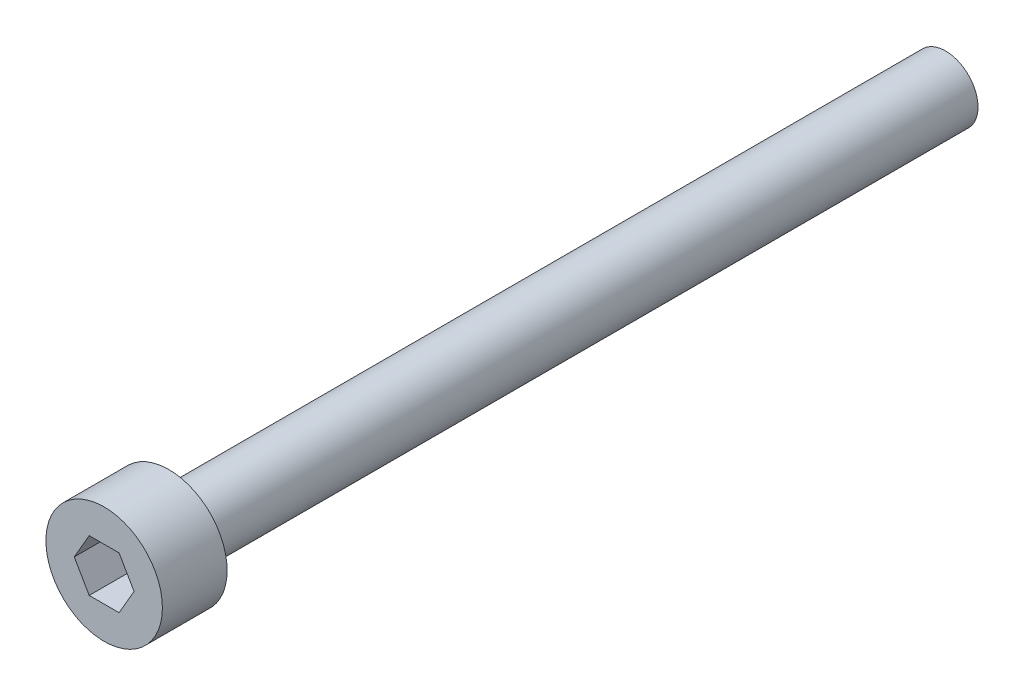
ISO-10303-21;
HEADER;
FILE_DESCRIPTION(('STEP AP214'),'2;1');
FILE_NAME('part.step','',(''),(''),'','','');
FILE_SCHEMA(('AUTOMOTIVE_DESIGN { 1 0 10303 214 1 1 1 1 }'));
ENDSEC;
DATA;
#1=APPLICATION_CONTEXT('core data for automotive mechanical design processes');
#2=APPLICATION_PROTOCOL_DEFINITION('international standard','automotive_design',2000,#1);
#3=PRODUCT_CONTEXT('',#1,'mechanical');
#4=PRODUCT('Part','Part','',(#3));
#5=PRODUCT_RELATED_PRODUCT_CATEGORY('part','',(#4));
#6=PRODUCT_DEFINITION_FORMATION('','',#4);
#7=PRODUCT_DEFINITION_CONTEXT('part definition',#1,'design');
#8=PRODUCT_DEFINITION('design','',#6,#7);
#9=PRODUCT_DEFINITION_SHAPE('','',#8);
#10=(LENGTH_UNIT() NAMED_UNIT(*) SI_UNIT(.MILLI.,.METRE.));
#11=(NAMED_UNIT(*) PLANE_ANGLE_UNIT() SI_UNIT($,.RADIAN.));
#12=(NAMED_UNIT(*) SI_UNIT($,.STERADIAN.) SOLID_ANGLE_UNIT());
#13=UNCERTAINTY_MEASURE_WITH_UNIT(LENGTH_MEASURE(1.E-05),#10,'distance_accuracy_value','');
#14=(GEOMETRIC_REPRESENTATION_CONTEXT(3) GLOBAL_UNCERTAINTY_ASSIGNED_CONTEXT((#13)) GLOBAL_UNIT_ASSIGNED_CONTEXT((#10,
#11,#12)) REPRESENTATION_CONTEXT('',''));
#15=CARTESIAN_POINT('',(0.,0.,0.));
#16=DIRECTION('',(0.,0.,1.));
#17=DIRECTION('',(1.,0.,0.));
#18=AXIS2_PLACEMENT_3D('',#15,#16,#17);
#19=CARTESIAN_POINT('',(0.,0.,30.));
#20=DIRECTION('',(0.,0.,-1.));
#21=DIRECTION('',(-1.,0.,0.));
#22=AXIS2_PLACEMENT_3D('',#19,#20,#21);
#23=CYLINDRICAL_SURFACE('',#22,1.25);
#24=CARTESIAN_POINT('',(0.,0.,30.));
#25=DIRECTION('',(0.,0.,1.));
#26=DIRECTION('',(1.,0.,0.));
#27=AXIS2_PLACEMENT_3D('',#24,#25,#26);
#28=CIRCLE('',#27,1.25);
#29=CARTESIAN_POINT('',(1.25,0.,30.));
#30=VERTEX_POINT('',#29);
#31=EDGE_CURVE('E11',#30,#30,#28,.T.);
#32=ORIENTED_EDGE('',*,*,#31,.F.);
#33=EDGE_LOOP('',(#32));
#34=FACE_BOUND('',#33,.T.);
#35=CARTESIAN_POINT('',(0.,0.,0.));
#36=DIRECTION('',(0.,0.,1.));
#37=DIRECTION('',(1.,0.,0.));
#38=AXIS2_PLACEMENT_3D('',#35,#36,#37);
#39=CIRCLE('',#38,1.25);
#40=CARTESIAN_POINT('',(1.25,0.,0.));
#41=VERTEX_POINT('',#40);
#42=EDGE_CURVE('E42',#41,#41,#39,.T.);
#43=ORIENTED_EDGE('',*,*,#42,.T.);
#44=EDGE_LOOP('',(#43));
#45=FACE_BOUND('',#44,.T.);
#46=ADVANCED_FACE('F39',(#34,#45),#23,.T.);
#47=CARTESIAN_POINT('',(0.,0.,0.));
#48=DIRECTION('',(0.,0.,1.));
#49=DIRECTION('',(1.,0.,0.));
#50=AXIS2_PLACEMENT_3D('',#47,#48,#49);
#51=PLANE('',#50);
#52=ORIENTED_EDGE('',*,*,#42,.F.);
#53=EDGE_LOOP('',(#52));
#54=FACE_BOUND('',#53,.T.);
#55=ADVANCED_FACE('F189',(#54),#51,.F.);
#56=CARTESIAN_POINT('',(0.,0.,32.5));
#57=DIRECTION('',(0.,0.,-1.));
#58=DIRECTION('',(-1.,0.,0.));
#59=AXIS2_PLACEMENT_3D('',#56,#57,#58);
#60=CYLINDRICAL_SURFACE('',#59,2.25);
#61=CARTESIAN_POINT('',(0.,0.,32.5));
#62=DIRECTION('',(0.,0.,1.));
#63=DIRECTION('',(1.,0.,0.));
#64=AXIS2_PLACEMENT_3D('',#61,#62,#63);
#65=CIRCLE('',#64,2.25);
#66=CARTESIAN_POINT('',(2.25,0.,32.5));
#67=VERTEX_POINT('',#66);
#68=EDGE_CURVE('E163',#67,#67,#65,.T.);
#69=ORIENTED_EDGE('',*,*,#68,.F.);
#70=EDGE_LOOP('',(#69));
#71=FACE_BOUND('',#70,.T.);
#72=CARTESIAN_POINT('',(0.,0.,30.));
#73=DIRECTION('',(0.,0.,1.));
#74=DIRECTION('',(1.,0.,0.));
#75=AXIS2_PLACEMENT_3D('',#72,#73,#74);
#76=CIRCLE('',#75,2.25);
#77=CARTESIAN_POINT('',(2.25,0.,30.));
#78=VERTEX_POINT('',#77);
#79=EDGE_CURVE('E153',#78,#78,#76,.T.);
#80=ORIENTED_EDGE('',*,*,#79,.T.);
#81=EDGE_LOOP('',(#80));
#82=FACE_BOUND('',#81,.T.);
#83=ADVANCED_FACE('F171',(#71,#82),#60,.T.);
#84=CARTESIAN_POINT('',(0.,0.,32.5));
#85=DIRECTION('',(0.,0.,1.));
#86=DIRECTION('',(1.,0.,0.));
#87=AXIS2_PLACEMENT_3D('',#84,#85,#86);
#88=PLANE('',#87);
#89=DIRECTION('',(0.5,0.866025403784439,0.));
#90=VECTOR('',#89,1.);
#91=CARTESIAN_POINT('',(0.577350269189626,-1.,32.5));
#92=LINE('',#91,#90);
#93=CARTESIAN_POINT('',(0.577350269189626,-1.,32.5));
#94=VERTEX_POINT('',#93);
#95=CARTESIAN_POINT('',(1.15470053837925,0.,32.5));
#96=VERTEX_POINT('',#95);
#97=EDGE_CURVE('E54',#94,#96,#92,.T.);
#98=ORIENTED_EDGE('',*,*,#97,.F.);
#99=DIRECTION('',(1.,0.,0.));
#100=VECTOR('',#99,1.);
#101=CARTESIAN_POINT('',(-0.577350269189626,-1.,32.5));
#102=LINE('',#101,#100);
#103=CARTESIAN_POINT('',(-0.577350269189626,-1.,32.5));
#104=VERTEX_POINT('',#103);
#105=EDGE_CURVE('E147',#104,#94,#102,.T.);
#106=ORIENTED_EDGE('',*,*,#105,.F.);
#107=DIRECTION('',(0.5,-0.866025403784439,0.));
#108=VECTOR('',#107,1.);
#109=CARTESIAN_POINT('',(-1.15470053837925,0.,32.5));
#110=LINE('',#109,#108);
#111=CARTESIAN_POINT('',(-1.15470053837925,0.,32.5));
#112=VERTEX_POINT('',#111);
#113=EDGE_CURVE('E144',#112,#104,#110,.T.);
#114=ORIENTED_EDGE('',*,*,#113,.F.);
#115=DIRECTION('',(-0.5,-0.866025403784439,0.));
#116=VECTOR('',#115,1.);
#117=CARTESIAN_POINT('',(-0.577350269189626,1.,32.5));
#118=LINE('',#117,#116);
#119=CARTESIAN_POINT('',(-0.577350269189626,1.,32.5));
#120=VERTEX_POINT('',#119);
#121=EDGE_CURVE('E102',#120,#112,#118,.T.);
#122=ORIENTED_EDGE('',*,*,#121,.F.);
#123=DIRECTION('',(-1.,0.,0.));
#124=VECTOR('',#123,1.);
#125=CARTESIAN_POINT('',(0.577350269189625,1.,32.5));
#126=LINE('',#125,#124);
#127=CARTESIAN_POINT('',(0.577350269189625,1.,32.5));
#128=VERTEX_POINT('',#127);
#129=EDGE_CURVE('E138',#128,#120,#126,.T.);
#130=ORIENTED_EDGE('',*,*,#129,.F.);
#131=DIRECTION('',(-0.5,0.866025403784439,0.));
#132=VECTOR('',#131,1.);
#133=CARTESIAN_POINT('',(1.15470053837925,0.,32.5));
#134=LINE('',#133,#132);
#135=EDGE_CURVE('E134',#96,#128,#134,.T.);
#136=ORIENTED_EDGE('',*,*,#135,.F.);
#137=EDGE_LOOP('',(#98,#106,#114,#122,#130,#136));
#138=FACE_BOUND('',#137,.T.);
#139=ORIENTED_EDGE('',*,*,#68,.T.);
#140=EDGE_LOOP('',(#139));
#141=FACE_BOUND('',#140,.T.);
#142=ADVANCED_FACE('F176',(#138,#141),#88,.T.);
#143=CARTESIAN_POINT('',(0.,0.,30.));
#144=DIRECTION('',(0.,0.,1.));
#145=DIRECTION('',(1.,0.,0.));
#146=AXIS2_PLACEMENT_3D('',#143,#144,#145);
#147=PLANE('',#146);
#148=ORIENTED_EDGE('',*,*,#31,.T.);
#149=EDGE_LOOP('',(#148));
#150=FACE_BOUND('',#149,.T.);
#151=ORIENTED_EDGE('',*,*,#79,.F.);
#152=EDGE_LOOP('',(#151));
#153=FACE_BOUND('',#152,.T.);
#154=ADVANCED_FACE('F173',(#150,#153),#147,.F.);
#155=CARTESIAN_POINT('',(0.577350269189626,-1.,31.));
#156=DIRECTION('',(0.866025403784439,-0.5,0.));
#157=DIRECTION('',(0.5,0.866025403784439,0.));
#158=AXIS2_PLACEMENT_3D('',#155,#156,#157);
#159=PLANE('',#158);
#160=ORIENTED_EDGE('',*,*,#97,.T.);
#161=DIRECTION('',(0.,0.,1.));
#162=VECTOR('',#161,1.);
#163=CARTESIAN_POINT('',(1.15470053837925,0.,31.));
#164=LINE('',#163,#162);
#165=CARTESIAN_POINT('',(1.15470053837925,0.,31.));
#166=VERTEX_POINT('',#165);
#167=EDGE_CURVE('E84',#166,#96,#164,.T.);
#168=ORIENTED_EDGE('',*,*,#167,.F.);
#169=DIRECTION('',(0.5,0.866025403784439,0.));
#170=VECTOR('',#169,1.);
#171=CARTESIAN_POINT('',(0.577350269189626,-1.,31.));
#172=LINE('',#171,#170);
#173=CARTESIAN_POINT('',(0.577350269189626,-1.,31.));
#174=VERTEX_POINT('',#173);
#175=EDGE_CURVE('E150',#174,#166,#172,.T.);
#176=ORIENTED_EDGE('',*,*,#175,.F.);
#177=DIRECTION('',(0.,0.,1.));
#178=VECTOR('',#177,1.);
#179=CARTESIAN_POINT('',(0.577350269189626,-1.,31.));
#180=LINE('',#179,#178);
#181=EDGE_CURVE('E62',#174,#94,#180,.T.);
#182=ORIENTED_EDGE('',*,*,#181,.T.);
#183=EDGE_LOOP('',(#160,#168,#176,#182));
#184=FACE_BOUND('',#183,.T.);
#185=ADVANCED_FACE('F175',(#184),#159,.F.);
#186=CARTESIAN_POINT('',(-0.577350269189626,-1.,31.));
#187=DIRECTION('',(0.,-1.,0.));
#188=DIRECTION('',(1.,0.,0.));
#189=AXIS2_PLACEMENT_3D('',#186,#187,#188);
#190=PLANE('',#189);
#191=ORIENTED_EDGE('',*,*,#105,.T.);
#192=ORIENTED_EDGE('',*,*,#181,.F.);
#193=DIRECTION('',(1.,0.,0.));
#194=VECTOR('',#193,1.);
#195=CARTESIAN_POINT('',(-0.577350269189626,-1.,31.));
#196=LINE('',#195,#194);
#197=CARTESIAN_POINT('',(-0.577350269189626,-1.,31.));
#198=VERTEX_POINT('',#197);
#199=EDGE_CURVE('E116',#198,#174,#196,.T.);
#200=ORIENTED_EDGE('',*,*,#199,.F.);
#201=DIRECTION('',(0.,0.,1.));
#202=VECTOR('',#201,1.);
#203=CARTESIAN_POINT('',(-0.577350269189626,-1.,31.));
#204=LINE('',#203,#202);
#205=EDGE_CURVE('E107',#198,#104,#204,.T.);
#206=ORIENTED_EDGE('',*,*,#205,.T.);
#207=EDGE_LOOP('',(#191,#192,#200,#206));
#208=FACE_BOUND('',#207,.T.);
#209=ADVANCED_FACE('F183',(#208),#190,.F.);
#210=CARTESIAN_POINT('',(-1.15470053837925,0.,31.));
#211=DIRECTION('',(-0.866025403784439,-0.5,0.));
#212=DIRECTION('',(0.5,-0.866025403784439,0.));
#213=AXIS2_PLACEMENT_3D('',#210,#211,#212);
#214=PLANE('',#213);
#215=ORIENTED_EDGE('',*,*,#113,.T.);
#216=ORIENTED_EDGE('',*,*,#205,.F.);
#217=DIRECTION('',(0.5,-0.866025403784439,0.));
#218=VECTOR('',#217,1.);
#219=CARTESIAN_POINT('',(-1.15470053837925,0.,31.));
#220=LINE('',#219,#218);
#221=CARTESIAN_POINT('',(-1.15470053837925,0.,31.));
#222=VERTEX_POINT('',#221);
#223=EDGE_CURVE('E111',#222,#198,#220,.T.);
#224=ORIENTED_EDGE('',*,*,#223,.F.);
#225=DIRECTION('',(0.,0.,1.));
#226=VECTOR('',#225,1.);
#227=CARTESIAN_POINT('',(-1.15470053837925,0.,31.));
#228=LINE('',#227,#226);
#229=EDGE_CURVE('E95',#222,#112,#228,.T.);
#230=ORIENTED_EDGE('',*,*,#229,.T.);
#231=EDGE_LOOP('',(#215,#216,#224,#230));
#232=FACE_BOUND('',#231,.T.);
#233=ADVANCED_FACE('F112',(#232),#214,.F.);
#234=CARTESIAN_POINT('',(-0.577350269189626,1.,31.));
#235=DIRECTION('',(-0.866025403784439,0.5,0.));
#236=DIRECTION('',(-0.5,-0.866025403784439,0.));
#237=AXIS2_PLACEMENT_3D('',#234,#235,#236);
#238=PLANE('',#237);
#239=ORIENTED_EDGE('',*,*,#121,.T.);
#240=ORIENTED_EDGE('',*,*,#229,.F.);
#241=DIRECTION('',(-0.5,-0.866025403784439,0.));
#242=VECTOR('',#241,1.);
#243=CARTESIAN_POINT('',(-0.577350269189626,1.,31.));
#244=LINE('',#243,#242);
#245=CARTESIAN_POINT('',(-0.577350269189626,1.,31.));
#246=VERTEX_POINT('',#245);
#247=EDGE_CURVE('E99',#246,#222,#244,.T.);
#248=ORIENTED_EDGE('',*,*,#247,.F.);
#249=DIRECTION('',(0.,0.,1.));
#250=VECTOR('',#249,1.);
#251=CARTESIAN_POINT('',(-0.577350269189626,1.,31.));
#252=LINE('',#251,#250);
#253=EDGE_CURVE('E108',#246,#120,#252,.T.);
#254=ORIENTED_EDGE('',*,*,#253,.T.);
#255=EDGE_LOOP('',(#239,#240,#248,#254));
#256=FACE_BOUND('',#255,.T.);
#257=ADVANCED_FACE('F97',(#256),#238,.F.);
#258=CARTESIAN_POINT('',(0.577350269189625,1.,31.));
#259=DIRECTION('',(0.,1.,0.));
#260=DIRECTION('',(0.,0.,1.));
#261=AXIS2_PLACEMENT_3D('',#258,#259,#260);
#262=PLANE('',#261);
#263=ORIENTED_EDGE('',*,*,#129,.T.);
#264=ORIENTED_EDGE('',*,*,#253,.F.);
#265=DIRECTION('',(-1.,0.,0.));
#266=VECTOR('',#265,1.);
#267=CARTESIAN_POINT('',(0.577350269189625,1.,31.));
#268=LINE('',#267,#266);
#269=CARTESIAN_POINT('',(0.577350269189625,1.,31.));
#270=VERTEX_POINT('',#269);
#271=EDGE_CURVE('E122',#270,#246,#268,.T.);
#272=ORIENTED_EDGE('',*,*,#271,.F.);
#273=DIRECTION('',(0.,0.,1.));
#274=VECTOR('',#273,1.);
#275=CARTESIAN_POINT('',(0.577350269189625,1.,31.));
#276=LINE('',#275,#274);
#277=EDGE_CURVE('E158',#270,#128,#276,.T.);
#278=ORIENTED_EDGE('',*,*,#277,.T.);
#279=EDGE_LOOP('',(#263,#264,#272,#278));
#280=FACE_BOUND('',#279,.T.);
#281=ADVANCED_FACE('F245',(#280),#262,.F.);
#282=CARTESIAN_POINT('',(1.15470053837925,0.,31.));
#283=DIRECTION('',(0.866025403784439,0.5,0.));
#284=DIRECTION('',(-0.5,0.866025403784439,0.));
#285=AXIS2_PLACEMENT_3D('',#282,#283,#284);
#286=PLANE('',#285);
#287=ORIENTED_EDGE('',*,*,#135,.T.);
#288=ORIENTED_EDGE('',*,*,#277,.F.);
#289=DIRECTION('',(-0.5,0.866025403784439,0.));
#290=VECTOR('',#289,1.);
#291=CARTESIAN_POINT('',(1.15470053837925,0.,31.));
#292=LINE('',#291,#290);
#293=EDGE_CURVE('E126',#166,#270,#292,.T.);
#294=ORIENTED_EDGE('',*,*,#293,.F.);
#295=ORIENTED_EDGE('',*,*,#167,.T.);
#296=EDGE_LOOP('',(#287,#288,#294,#295));
#297=FACE_BOUND('',#296,.T.);
#298=ADVANCED_FACE('F254',(#297),#286,.F.);
#299=CARTESIAN_POINT('',(0.,0.,31.));
#300=DIRECTION('',(0.,0.,1.));
#301=DIRECTION('',(1.,0.,0.));
#302=AXIS2_PLACEMENT_3D('',#299,#300,#301);
#303=PLANE('',#302);
#304=ORIENTED_EDGE('',*,*,#175,.T.);
#305=ORIENTED_EDGE('',*,*,#293,.T.);
#306=ORIENTED_EDGE('',*,*,#271,.T.);
#307=ORIENTED_EDGE('',*,*,#247,.T.);
#308=ORIENTED_EDGE('',*,*,#223,.T.);
#309=ORIENTED_EDGE('',*,*,#199,.T.);
#310=EDGE_LOOP('',(#304,#305,#306,#307,#308,#309));
#311=FACE_BOUND('',#310,.T.);
#312=ADVANCED_FACE('F119',(#311),#303,.T.);
#313=CLOSED_SHELL('',(#46,#55,#83,#142,#154,#185,#209,#233,#257,#281,#298,#312));
#314=MANIFOLD_SOLID_BREP('B2',#313);
#315=ADVANCED_BREP_SHAPE_REPRESENTATION('',(#18,#314),#14);
#316=SHAPE_DEFINITION_REPRESENTATION(#9,#315);
ENDSEC;
END-ISO-10303-21;
